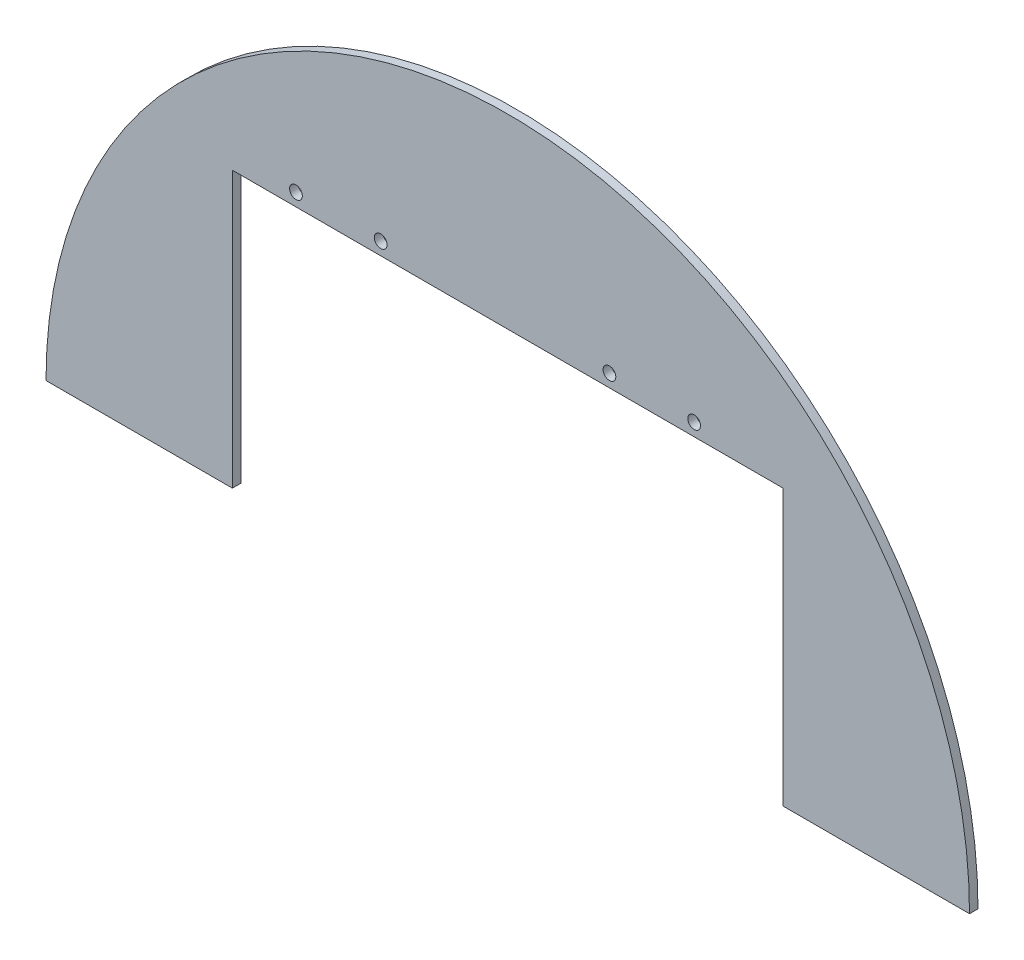
ISO-10303-21;
HEADER;
FILE_DESCRIPTION(('STEP AP214'),'2;1');
FILE_NAME('part.step','',(''),(''),'','','');
FILE_SCHEMA(('AUTOMOTIVE_DESIGN { 1 0 10303 214 1 1 1 1 }'));
ENDSEC;
DATA;
#1=APPLICATION_CONTEXT('core data for automotive mechanical design processes');
#2=APPLICATION_PROTOCOL_DEFINITION('international standard','automotive_design',2000,#1);
#3=PRODUCT_CONTEXT('',#1,'mechanical');
#4=PRODUCT('Part','Part','',(#3));
#5=PRODUCT_RELATED_PRODUCT_CATEGORY('part','',(#4));
#6=PRODUCT_DEFINITION_FORMATION('','',#4);
#7=PRODUCT_DEFINITION_CONTEXT('part definition',#1,'design');
#8=PRODUCT_DEFINITION('design','',#6,#7);
#9=PRODUCT_DEFINITION_SHAPE('','',#8);
#10=(LENGTH_UNIT() NAMED_UNIT(*) SI_UNIT(.MILLI.,.METRE.));
#11=(NAMED_UNIT(*) PLANE_ANGLE_UNIT() SI_UNIT($,.RADIAN.));
#12=(NAMED_UNIT(*) SI_UNIT($,.STERADIAN.) SOLID_ANGLE_UNIT());
#13=UNCERTAINTY_MEASURE_WITH_UNIT(LENGTH_MEASURE(1.E-05),#10,'distance_accuracy_value','');
#14=(GEOMETRIC_REPRESENTATION_CONTEXT(3) GLOBAL_UNCERTAINTY_ASSIGNED_CONTEXT((#13)) GLOBAL_UNIT_ASSIGNED_CONTEXT((#10,
#11,#12)) REPRESENTATION_CONTEXT('',''));
#15=CARTESIAN_POINT('',(0.,0.,0.));
#16=DIRECTION('',(0.,0.,1.));
#17=DIRECTION('',(1.,0.,0.));
#18=AXIS2_PLACEMENT_3D('',#15,#16,#17);
#19=CARTESIAN_POINT('',(0.,0.,1.));
#20=DIRECTION('',(0.,-1.,0.));
#21=DIRECTION('',(0.,0.,-1.));
#22=AXIS2_PLACEMENT_3D('',#19,#20,#21);
#23=PLANE('',#22);
#24=DIRECTION('',(-1.,0.,0.));
#25=VECTOR('',#24,1.);
#26=CARTESIAN_POINT('',(0.,0.,-1.));
#27=LINE('',#26,#25);
#28=CARTESIAN_POINT('',(109.,0.,-1.));
#29=VERTEX_POINT('',#28);
#30=CARTESIAN_POINT('',(65.,0.,-1.));
#31=VERTEX_POINT('',#30);
#32=EDGE_CURVE('E124',#29,#31,#27,.T.);
#33=ORIENTED_EDGE('',*,*,#32,.F.);
#34=DIRECTION('',(0.,0.,-1.));
#35=VECTOR('',#34,1.);
#36=CARTESIAN_POINT('',(109.,0.,1.));
#37=LINE('',#36,#35);
#38=CARTESIAN_POINT('',(109.,0.,1.));
#39=VERTEX_POINT('',#38);
#40=EDGE_CURVE('E11',#39,#29,#37,.T.);
#41=ORIENTED_EDGE('',*,*,#40,.F.);
#42=DIRECTION('',(-1.,0.,0.));
#43=VECTOR('',#42,1.);
#44=CARTESIAN_POINT('',(0.,0.,1.));
#45=LINE('',#44,#43);
#46=CARTESIAN_POINT('',(65.,0.,1.));
#47=VERTEX_POINT('',#46);
#48=EDGE_CURVE('E120',#39,#47,#45,.T.);
#49=ORIENTED_EDGE('',*,*,#48,.T.);
#50=DIRECTION('',(0.,0.,-1.));
#51=VECTOR('',#50,1.);
#52=CARTESIAN_POINT('',(65.,0.,1.));
#53=LINE('',#52,#51);
#54=EDGE_CURVE('E85',#47,#31,#53,.T.);
#55=ORIENTED_EDGE('',*,*,#54,.T.);
#56=EDGE_LOOP('',(#33,#41,#49,#55));
#57=FACE_BOUND('',#56,.T.);
#58=ADVANCED_FACE('F38',(#57),#23,.T.);
#59=CARTESIAN_POINT('',(0.,0.,1.));
#60=DIRECTION('',(0.,0.,-1.));
#61=DIRECTION('',(-1.,0.,0.));
#62=AXIS2_PLACEMENT_3D('',#59,#60,#61);
#63=CYLINDRICAL_SURFACE('',#62,109.);
#64=CARTESIAN_POINT('',(0.,0.,-1.));
#65=DIRECTION('',(0.,0.,1.));
#66=DIRECTION('',(1.,0.,0.));
#67=AXIS2_PLACEMENT_3D('',#64,#65,#66);
#68=CIRCLE('',#67,109.);
#69=CARTESIAN_POINT('',(-109.,0.,-1.));
#70=VERTEX_POINT('',#69);
#71=EDGE_CURVE('E127',#29,#70,#68,.T.);
#72=ORIENTED_EDGE('',*,*,#71,.T.);
#73=DIRECTION('',(0.,0.,-1.));
#74=VECTOR('',#73,1.);
#75=CARTESIAN_POINT('',(-109.,0.,1.));
#76=LINE('',#75,#74);
#77=CARTESIAN_POINT('',(-109.,0.,1.));
#78=VERTEX_POINT('',#77);
#79=EDGE_CURVE('E48',#78,#70,#76,.T.);
#80=ORIENTED_EDGE('',*,*,#79,.F.);
#81=CARTESIAN_POINT('',(0.,0.,1.));
#82=DIRECTION('',(0.,0.,1.));
#83=DIRECTION('',(1.,0.,0.));
#84=AXIS2_PLACEMENT_3D('',#81,#82,#83);
#85=CIRCLE('',#84,109.);
#86=EDGE_CURVE('E118',#39,#78,#85,.T.);
#87=ORIENTED_EDGE('',*,*,#86,.F.);
#88=ORIENTED_EDGE('',*,*,#40,.T.);
#89=EDGE_LOOP('',(#72,#80,#87,#88));
#90=FACE_BOUND('',#89,.T.);
#91=ADVANCED_FACE('F40',(#90),#63,.T.);
#92=CARTESIAN_POINT('',(-65.,0.,-1.));
#93=VERTEX_POINT('',#92);
#94=EDGE_CURVE('E128',#93,#70,#27,.T.);
#95=ORIENTED_EDGE('',*,*,#94,.F.);
#96=DIRECTION('',(0.,0.,-1.));
#97=VECTOR('',#96,1.);
#98=CARTESIAN_POINT('',(-65.,0.,1.));
#99=LINE('',#98,#97);
#100=CARTESIAN_POINT('',(-65.,0.,1.));
#101=VERTEX_POINT('',#100);
#102=EDGE_CURVE('E107',#101,#93,#99,.T.);
#103=ORIENTED_EDGE('',*,*,#102,.F.);
#104=EDGE_CURVE('E116',#101,#78,#45,.T.);
#105=ORIENTED_EDGE('',*,*,#104,.T.);
#106=ORIENTED_EDGE('',*,*,#79,.T.);
#107=EDGE_LOOP('',(#95,#103,#105,#106));
#108=FACE_BOUND('',#107,.T.);
#109=ADVANCED_FACE('F167',(#108),#23,.T.);
#110=CARTESIAN_POINT('',(-65.,0.,1.));
#111=DIRECTION('',(1.,0.,0.));
#112=DIRECTION('',(0.,0.,-1.));
#113=AXIS2_PLACEMENT_3D('',#110,#111,#112);
#114=PLANE('',#113);
#115=DIRECTION('',(0.,-1.,0.));
#116=VECTOR('',#115,1.);
#117=CARTESIAN_POINT('',(-65.,0.,-1.));
#118=LINE('',#117,#116);
#119=CARTESIAN_POINT('',(-65.,65.,-1.));
#120=VERTEX_POINT('',#119);
#121=EDGE_CURVE('E106',#120,#93,#118,.T.);
#122=ORIENTED_EDGE('',*,*,#121,.F.);
#123=DIRECTION('',(0.,0.,-1.));
#124=VECTOR('',#123,1.);
#125=CARTESIAN_POINT('',(-65.,65.,1.));
#126=LINE('',#125,#124);
#127=CARTESIAN_POINT('',(-65.,65.,1.));
#128=VERTEX_POINT('',#127);
#129=EDGE_CURVE('E100',#128,#120,#126,.T.);
#130=ORIENTED_EDGE('',*,*,#129,.F.);
#131=DIRECTION('',(0.,-1.,0.));
#132=VECTOR('',#131,1.);
#133=CARTESIAN_POINT('',(-65.,0.,1.));
#134=LINE('',#133,#132);
#135=EDGE_CURVE('E104',#128,#101,#134,.T.);
#136=ORIENTED_EDGE('',*,*,#135,.T.);
#137=ORIENTED_EDGE('',*,*,#102,.T.);
#138=EDGE_LOOP('',(#122,#130,#136,#137));
#139=FACE_BOUND('',#138,.T.);
#140=ADVANCED_FACE('F102',(#139),#114,.T.);
#141=CARTESIAN_POINT('',(0.,65.,1.));
#142=DIRECTION('',(0.,1.,0.));
#143=DIRECTION('',(0.,0.,1.));
#144=AXIS2_PLACEMENT_3D('',#141,#142,#143);
#145=PLANE('',#144);
#146=DIRECTION('',(1.,0.,0.));
#147=VECTOR('',#146,1.);
#148=CARTESIAN_POINT('',(0.,65.,-1.));
#149=LINE('',#148,#147);
#150=CARTESIAN_POINT('',(65.,65.,-1.));
#151=VERTEX_POINT('',#150);
#152=EDGE_CURVE('E78',#120,#151,#149,.T.);
#153=ORIENTED_EDGE('',*,*,#152,.T.);
#154=DIRECTION('',(0.,0.,-1.));
#155=VECTOR('',#154,1.);
#156=CARTESIAN_POINT('',(65.,65.,1.));
#157=LINE('',#156,#155);
#158=CARTESIAN_POINT('',(65.,65.,1.));
#159=VERTEX_POINT('',#158);
#160=EDGE_CURVE('E108',#159,#151,#157,.T.);
#161=ORIENTED_EDGE('',*,*,#160,.F.);
#162=DIRECTION('',(1.,0.,0.));
#163=VECTOR('',#162,1.);
#164=CARTESIAN_POINT('',(0.,65.,1.));
#165=LINE('',#164,#163);
#166=EDGE_CURVE('E110',#128,#159,#165,.T.);
#167=ORIENTED_EDGE('',*,*,#166,.F.);
#168=ORIENTED_EDGE('',*,*,#129,.T.);
#169=EDGE_LOOP('',(#153,#161,#167,#168));
#170=FACE_BOUND('',#169,.T.);
#171=ADVANCED_FACE('F111',(#170),#145,.F.);
#172=CARTESIAN_POINT('',(65.,0.,1.));
#173=DIRECTION('',(1.,0.,0.));
#174=DIRECTION('',(0.,0.,-1.));
#175=AXIS2_PLACEMENT_3D('',#172,#173,#174);
#176=PLANE('',#175);
#177=DIRECTION('',(0.,-1.,0.));
#178=VECTOR('',#177,1.);
#179=CARTESIAN_POINT('',(65.,0.,-1.));
#180=LINE('',#179,#178);
#181=EDGE_CURVE('E133',#151,#31,#180,.T.);
#182=ORIENTED_EDGE('',*,*,#181,.T.);
#183=ORIENTED_EDGE('',*,*,#54,.F.);
#184=DIRECTION('',(0.,-1.,0.));
#185=VECTOR('',#184,1.);
#186=CARTESIAN_POINT('',(65.,0.,1.));
#187=LINE('',#186,#185);
#188=EDGE_CURVE('E57',#159,#47,#187,.T.);
#189=ORIENTED_EDGE('',*,*,#188,.F.);
#190=ORIENTED_EDGE('',*,*,#160,.T.);
#191=EDGE_LOOP('',(#182,#183,#189,#190));
#192=FACE_BOUND('',#191,.T.);
#193=ADVANCED_FACE('F185',(#192),#176,.F.);
#194=CARTESIAN_POINT('',(0.,0.,1.));
#195=DIRECTION('',(0.,0.,1.));
#196=DIRECTION('',(1.,0.,0.));
#197=AXIS2_PLACEMENT_3D('',#194,#195,#196);
#198=PLANE('',#197);
#199=CARTESIAN_POINT('',(44.,68.,1.));
#200=DIRECTION('',(0.,0.,1.));
#201=DIRECTION('',(1.,0.,0.));
#202=AXIS2_PLACEMENT_3D('',#199,#200,#201);
#203=CIRCLE('',#202,1.5);
#204=CARTESIAN_POINT('',(45.5,68.,1.));
#205=VERTEX_POINT('',#204);
#206=EDGE_CURVE('E143',#205,#205,#203,.T.);
#207=ORIENTED_EDGE('',*,*,#206,.F.);
#208=EDGE_LOOP('',(#207));
#209=FACE_BOUND('',#208,.T.);
#210=CARTESIAN_POINT('',(24.,68.,1.));
#211=DIRECTION('',(0.,0.,1.));
#212=DIRECTION('',(1.,0.,0.));
#213=AXIS2_PLACEMENT_3D('',#210,#211,#212);
#214=CIRCLE('',#213,1.5);
#215=CARTESIAN_POINT('',(25.5,68.,1.));
#216=VERTEX_POINT('',#215);
#217=EDGE_CURVE('E193',#216,#216,#214,.T.);
#218=ORIENTED_EDGE('',*,*,#217,.F.);
#219=EDGE_LOOP('',(#218));
#220=FACE_BOUND('',#219,.T.);
#221=CARTESIAN_POINT('',(-30.0000000001217,68.0000000000679,1.));
#222=DIRECTION('',(0.,0.,1.));
#223=DIRECTION('',(1.,0.,0.));
#224=AXIS2_PLACEMENT_3D('',#221,#222,#223);
#225=CIRCLE('',#224,1.5);
#226=CARTESIAN_POINT('',(-28.5000000001217,68.0000000000679,1.));
#227=VERTEX_POINT('',#226);
#228=EDGE_CURVE('E190',#227,#227,#225,.T.);
#229=ORIENTED_EDGE('',*,*,#228,.F.);
#230=EDGE_LOOP('',(#229));
#231=FACE_BOUND('',#230,.T.);
#232=CARTESIAN_POINT('',(-50.0000000001217,68.000000000053,1.));
#233=DIRECTION('',(0.,0.,1.));
#234=DIRECTION('',(1.,0.,0.));
#235=AXIS2_PLACEMENT_3D('',#232,#233,#234);
#236=CIRCLE('',#235,1.5);
#237=CARTESIAN_POINT('',(-48.5000000001217,68.000000000053,1.));
#238=VERTEX_POINT('',#237);
#239=EDGE_CURVE('E187',#238,#238,#236,.T.);
#240=ORIENTED_EDGE('',*,*,#239,.F.);
#241=EDGE_LOOP('',(#240));
#242=FACE_BOUND('',#241,.T.);
#243=ORIENTED_EDGE('',*,*,#48,.F.);
#244=ORIENTED_EDGE('',*,*,#86,.T.);
#245=ORIENTED_EDGE('',*,*,#104,.F.);
#246=ORIENTED_EDGE('',*,*,#135,.F.);
#247=ORIENTED_EDGE('',*,*,#166,.T.);
#248=ORIENTED_EDGE('',*,*,#188,.T.);
#249=EDGE_LOOP('',(#243,#244,#245,#246,#247,#248));
#250=FACE_BOUND('',#249,.T.);
#251=ADVANCED_FACE('F114',(#209,#220,#231,#242,#250),#198,.T.);
#252=CARTESIAN_POINT('',(0.,0.,-1.));
#253=DIRECTION('',(0.,0.,1.));
#254=DIRECTION('',(1.,0.,0.));
#255=AXIS2_PLACEMENT_3D('',#252,#253,#254);
#256=PLANE('',#255);
#257=CARTESIAN_POINT('',(44.,68.,-1.));
#258=DIRECTION('',(0.,0.,1.));
#259=DIRECTION('',(1.,0.,0.));
#260=AXIS2_PLACEMENT_3D('',#257,#258,#259);
#261=CIRCLE('',#260,1.5);
#262=CARTESIAN_POINT('',(45.5,68.,-1.));
#263=VERTEX_POINT('',#262);
#264=EDGE_CURVE('E42',#263,#263,#261,.T.);
#265=ORIENTED_EDGE('',*,*,#264,.T.);
#266=EDGE_LOOP('',(#265));
#267=FACE_BOUND('',#266,.T.);
#268=CARTESIAN_POINT('',(24.,68.,-1.));
#269=DIRECTION('',(0.,0.,1.));
#270=DIRECTION('',(1.,0.,0.));
#271=AXIS2_PLACEMENT_3D('',#268,#269,#270);
#272=CIRCLE('',#271,1.5);
#273=CARTESIAN_POINT('',(25.5,68.,-1.));
#274=VERTEX_POINT('',#273);
#275=EDGE_CURVE('E145',#274,#274,#272,.T.);
#276=ORIENTED_EDGE('',*,*,#275,.T.);
#277=EDGE_LOOP('',(#276));
#278=FACE_BOUND('',#277,.T.);
#279=CARTESIAN_POINT('',(-30.0000000001217,68.0000000000679,-1.));
#280=DIRECTION('',(0.,0.,1.));
#281=DIRECTION('',(1.,0.,0.));
#282=AXIS2_PLACEMENT_3D('',#279,#280,#281);
#283=CIRCLE('',#282,1.5);
#284=CARTESIAN_POINT('',(-28.5000000001217,68.0000000000679,-1.));
#285=VERTEX_POINT('',#284);
#286=EDGE_CURVE('E142',#285,#285,#283,.T.);
#287=ORIENTED_EDGE('',*,*,#286,.T.);
#288=EDGE_LOOP('',(#287));
#289=FACE_BOUND('',#288,.T.);
#290=CARTESIAN_POINT('',(-50.0000000001217,68.000000000053,-1.));
#291=DIRECTION('',(0.,0.,1.));
#292=DIRECTION('',(1.,0.,0.));
#293=AXIS2_PLACEMENT_3D('',#290,#291,#292);
#294=CIRCLE('',#293,1.5);
#295=CARTESIAN_POINT('',(-48.5000000001217,68.000000000053,-1.));
#296=VERTEX_POINT('',#295);
#297=EDGE_CURVE('E139',#296,#296,#294,.T.);
#298=ORIENTED_EDGE('',*,*,#297,.T.);
#299=EDGE_LOOP('',(#298));
#300=FACE_BOUND('',#299,.T.);
#301=ORIENTED_EDGE('',*,*,#32,.T.);
#302=ORIENTED_EDGE('',*,*,#181,.F.);
#303=ORIENTED_EDGE('',*,*,#152,.F.);
#304=ORIENTED_EDGE('',*,*,#121,.T.);
#305=ORIENTED_EDGE('',*,*,#94,.T.);
#306=ORIENTED_EDGE('',*,*,#71,.F.);
#307=EDGE_LOOP('',(#301,#302,#303,#304,#305,#306));
#308=FACE_BOUND('',#307,.T.);
#309=ADVANCED_FACE('F152',(#267,#278,#289,#300,#308),#256,.F.);
#310=CARTESIAN_POINT('',(-50.0000000001217,68.000000000053,-9.));
#311=DIRECTION('',(0.,0.,1.));
#312=DIRECTION('',(1.,0.,0.));
#313=AXIS2_PLACEMENT_3D('',#310,#311,#312);
#314=CYLINDRICAL_SURFACE('',#313,1.5);
#315=ORIENTED_EDGE('',*,*,#239,.T.);
#316=EDGE_LOOP('',(#315));
#317=FACE_BOUND('',#316,.T.);
#318=ORIENTED_EDGE('',*,*,#297,.F.);
#319=EDGE_LOOP('',(#318));
#320=FACE_BOUND('',#319,.T.);
#321=ADVANCED_FACE('F207',(#317,#320),#314,.F.);
#322=CARTESIAN_POINT('',(-30.0000000001217,68.0000000000679,-9.));
#323=DIRECTION('',(0.,0.,1.));
#324=DIRECTION('',(1.,0.,0.));
#325=AXIS2_PLACEMENT_3D('',#322,#323,#324);
#326=CYLINDRICAL_SURFACE('',#325,1.5);
#327=ORIENTED_EDGE('',*,*,#228,.T.);
#328=EDGE_LOOP('',(#327));
#329=FACE_BOUND('',#328,.T.);
#330=ORIENTED_EDGE('',*,*,#286,.F.);
#331=EDGE_LOOP('',(#330));
#332=FACE_BOUND('',#331,.T.);
#333=ADVANCED_FACE('F162',(#329,#332),#326,.F.);
#334=CARTESIAN_POINT('',(24.,68.,-9.));
#335=DIRECTION('',(0.,0.,1.));
#336=DIRECTION('',(1.,0.,0.));
#337=AXIS2_PLACEMENT_3D('',#334,#335,#336);
#338=CYLINDRICAL_SURFACE('',#337,1.5);
#339=ORIENTED_EDGE('',*,*,#217,.T.);
#340=EDGE_LOOP('',(#339));
#341=FACE_BOUND('',#340,.T.);
#342=ORIENTED_EDGE('',*,*,#275,.F.);
#343=EDGE_LOOP('',(#342));
#344=FACE_BOUND('',#343,.T.);
#345=ADVANCED_FACE('F156',(#341,#344),#338,.F.);
#346=CARTESIAN_POINT('',(44.,68.,-9.));
#347=DIRECTION('',(0.,0.,1.));
#348=DIRECTION('',(1.,0.,0.));
#349=AXIS2_PLACEMENT_3D('',#346,#347,#348);
#350=CYLINDRICAL_SURFACE('',#349,1.5);
#351=ORIENTED_EDGE('',*,*,#206,.T.);
#352=EDGE_LOOP('',(#351));
#353=FACE_BOUND('',#352,.T.);
#354=ORIENTED_EDGE('',*,*,#264,.F.);
#355=EDGE_LOOP('',(#354));
#356=FACE_BOUND('',#355,.T.);
#357=ADVANCED_FACE('F154',(#353,#356),#350,.F.);
#358=CLOSED_SHELL('',(#58,#91,#109,#140,#171,#193,#251,#309,#321,#333,#345,#357));
#359=MANIFOLD_SOLID_BREP('B2',#358);
#360=ADVANCED_BREP_SHAPE_REPRESENTATION('',(#18,#359),#14);
#361=SHAPE_DEFINITION_REPRESENTATION(#9,#360);
ENDSEC;
END-ISO-10303-21;
